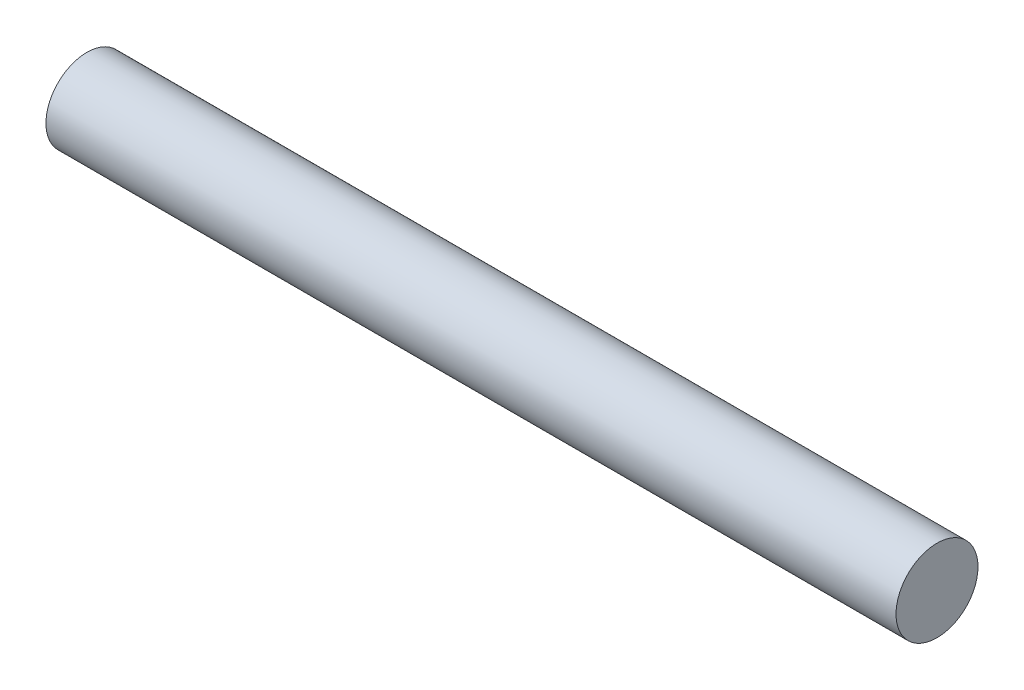
ISO-10303-21;
HEADER;
FILE_DESCRIPTION(('STEP AP214'),'2;1');
FILE_NAME('part.step','',(''),(''),'','','');
FILE_SCHEMA(('AUTOMOTIVE_DESIGN { 1 0 10303 214 1 1 1 1 }'));
ENDSEC;
DATA;
#1=APPLICATION_CONTEXT('core data for automotive mechanical design processes');
#2=APPLICATION_PROTOCOL_DEFINITION('international standard','automotive_design',2000,#1);
#3=PRODUCT_CONTEXT('',#1,'mechanical');
#4=PRODUCT('Part','Part','',(#3));
#5=PRODUCT_RELATED_PRODUCT_CATEGORY('part','',(#4));
#6=PRODUCT_DEFINITION_FORMATION('','',#4);
#7=PRODUCT_DEFINITION_CONTEXT('part definition',#1,'design');
#8=PRODUCT_DEFINITION('design','',#6,#7);
#9=PRODUCT_DEFINITION_SHAPE('','',#8);
#10=(LENGTH_UNIT() NAMED_UNIT(*) SI_UNIT(.MILLI.,.METRE.));
#11=(NAMED_UNIT(*) PLANE_ANGLE_UNIT() SI_UNIT($,.RADIAN.));
#12=(NAMED_UNIT(*) SI_UNIT($,.STERADIAN.) SOLID_ANGLE_UNIT());
#13=UNCERTAINTY_MEASURE_WITH_UNIT(LENGTH_MEASURE(1.E-05),#10,'distance_accuracy_value','');
#14=(GEOMETRIC_REPRESENTATION_CONTEXT(3) GLOBAL_UNCERTAINTY_ASSIGNED_CONTEXT((#13)) GLOBAL_UNIT_ASSIGNED_CONTEXT((#10,
#11,#12)) REPRESENTATION_CONTEXT('',''));
#15=CARTESIAN_POINT('',(0.,0.,0.));
#16=DIRECTION('',(0.,0.,1.));
#17=DIRECTION('',(1.,0.,0.));
#18=AXIS2_PLACEMENT_3D('',#15,#16,#17);
#19=CARTESIAN_POINT('',(-169.135499988,-97.7500000000005,219.8250001));
#20=DIRECTION('',(1.,0.,0.));
#21=DIRECTION('',(0.,0.,-1.));
#22=AXIS2_PLACEMENT_3D('',#19,#20,#21);
#23=PLANE('',#22);
#24=CARTESIAN_POINT('',(-169.135499988,-97.7500000000005,219.8250001));
#25=DIRECTION('',(1.,0.,0.));
#26=DIRECTION('',(0.,0.,-1.));
#27=AXIS2_PLACEMENT_3D('',#24,#25,#26);
#28=CIRCLE('',#27,3.17500000000001);
#29=CARTESIAN_POINT('',(-169.135499988,-97.7500000000005,216.6500001));
#30=VERTEX_POINT('',#29);
#31=EDGE_CURVE('E56',#30,#30,#28,.T.);
#32=ORIENTED_EDGE('',*,*,#31,.F.);
#33=EDGE_LOOP('',(#32));
#34=FACE_BOUND('',#33,.T.);
#35=ADVANCED_FACE('F49',(#34),#23,.F.);
#36=CARTESIAN_POINT('',(-103.290499988,-97.7500000000003,219.8250001));
#37=DIRECTION('',(1.,0.,0.));
#38=DIRECTION('',(0.,0.,-1.));
#39=AXIS2_PLACEMENT_3D('',#36,#37,#38);
#40=PLANE('',#39);
#41=CARTESIAN_POINT('',(-103.290499988,-97.7500000000003,219.8250001));
#42=DIRECTION('',(1.,0.,0.));
#43=DIRECTION('',(0.,0.,-1.));
#44=AXIS2_PLACEMENT_3D('',#41,#42,#43);
#45=CIRCLE('',#44,3.17500000000001);
#46=CARTESIAN_POINT('',(-103.290499988,-97.7500000000003,216.6500001));
#47=VERTEX_POINT('',#46);
#48=EDGE_CURVE('E11',#47,#47,#45,.T.);
#49=ORIENTED_EDGE('',*,*,#48,.T.);
#50=EDGE_LOOP('',(#49));
#51=FACE_BOUND('',#50,.T.);
#52=ADVANCED_FACE('F66',(#51),#40,.T.);
#53=CARTESIAN_POINT('',(-169.135499988,-97.7500000000005,219.8250001));
#54=DIRECTION('',(1.,0.,0.));
#55=DIRECTION('',(0.,1.,0.));
#56=AXIS2_PLACEMENT_3D('',#53,#54,#55);
#57=CYLINDRICAL_SURFACE('',#56,3.17500000000001);
#58=ORIENTED_EDGE('',*,*,#48,.F.);
#59=EDGE_LOOP('',(#58));
#60=FACE_BOUND('',#59,.T.);
#61=ORIENTED_EDGE('',*,*,#31,.T.);
#62=EDGE_LOOP('',(#61));
#63=FACE_BOUND('',#62,.T.);
#64=ADVANCED_FACE('F63',(#60,#63),#57,.T.);
#65=CLOSED_SHELL('',(#35,#52,#64));
#66=MANIFOLD_SOLID_BREP('B2',#65);
#67=ADVANCED_BREP_SHAPE_REPRESENTATION('',(#18,#66),#14);
#68=SHAPE_DEFINITION_REPRESENTATION(#9,#67);
ENDSEC;
END-ISO-10303-21;
